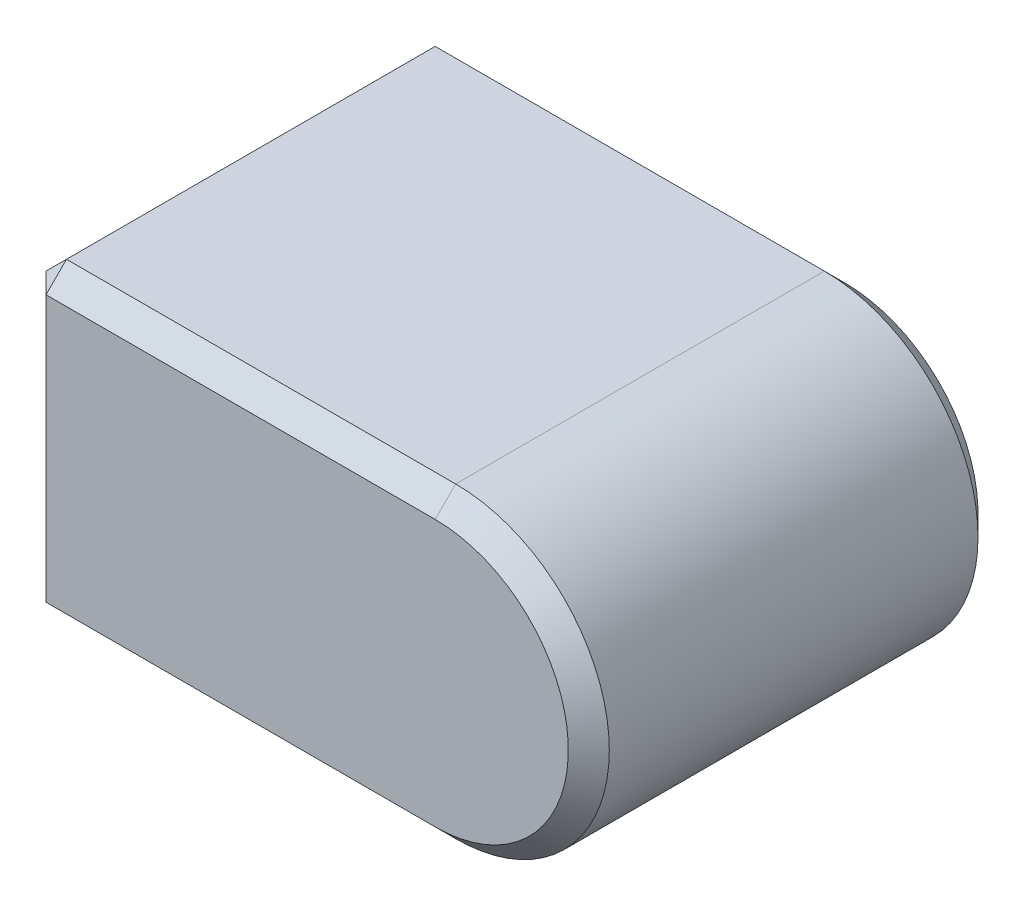
ISO-10303-21;
HEADER;
FILE_DESCRIPTION(('STEP AP214'),'2;1');
FILE_NAME('part.step','',(''),(''),'','','');
FILE_SCHEMA(('AUTOMOTIVE_DESIGN { 1 0 10303 214 1 1 1 1 }'));
ENDSEC;
DATA;
#1=APPLICATION_CONTEXT('core data for automotive mechanical design processes');
#2=APPLICATION_PROTOCOL_DEFINITION('international standard','automotive_design',2000,#1);
#3=PRODUCT_CONTEXT('',#1,'mechanical');
#4=PRODUCT('Part','Part','',(#3));
#5=PRODUCT_RELATED_PRODUCT_CATEGORY('part','',(#4));
#6=PRODUCT_DEFINITION_FORMATION('','',#4);
#7=PRODUCT_DEFINITION_CONTEXT('part definition',#1,'design');
#8=PRODUCT_DEFINITION('design','',#6,#7);
#9=PRODUCT_DEFINITION_SHAPE('','',#8);
#10=(LENGTH_UNIT() NAMED_UNIT(*) SI_UNIT(.MILLI.,.METRE.));
#11=(NAMED_UNIT(*) PLANE_ANGLE_UNIT() SI_UNIT($,.RADIAN.));
#12=(NAMED_UNIT(*) SI_UNIT($,.STERADIAN.) SOLID_ANGLE_UNIT());
#13=UNCERTAINTY_MEASURE_WITH_UNIT(LENGTH_MEASURE(1.E-05),#10,'distance_accuracy_value','');
#14=(GEOMETRIC_REPRESENTATION_CONTEXT(3) GLOBAL_UNCERTAINTY_ASSIGNED_CONTEXT((#13)) GLOBAL_UNIT_ASSIGNED_CONTEXT((#10,
#11,#12)) REPRESENTATION_CONTEXT('',''));
#15=CARTESIAN_POINT('',(0.,0.,0.));
#16=DIRECTION('',(0.,0.,1.));
#17=DIRECTION('',(1.,0.,0.));
#18=AXIS2_PLACEMENT_3D('',#15,#16,#17);
#19=CARTESIAN_POINT('',(2.,0.,4.));
#20=DIRECTION('',(0.,0.,-1.));
#21=DIRECTION('',(-1.,0.,0.));
#22=AXIS2_PLACEMENT_3D('',#19,#20,#21);
#23=CYLINDRICAL_SURFACE('',#22,1.5);
#24=DIRECTION('',(0.,0.,-1.));
#25=VECTOR('',#24,1.);
#26=CARTESIAN_POINT('',(2.,-1.5,4.));
#27=LINE('',#26,#25);
#28=CARTESIAN_POINT('',(2.,-1.5,3.8));
#29=VERTEX_POINT('',#28);
#30=CARTESIAN_POINT('',(2.,-1.5,0.2));
#31=VERTEX_POINT('',#30);
#32=EDGE_CURVE('E172',#29,#31,#27,.T.);
#33=ORIENTED_EDGE('',*,*,#32,.T.);
#34=CARTESIAN_POINT('',(2.,0.,0.2));
#35=DIRECTION('',(0.,0.,1.));
#36=DIRECTION('',(1.,0.,0.));
#37=AXIS2_PLACEMENT_3D('',#34,#35,#36);
#38=CIRCLE('',#37,1.5);
#39=CARTESIAN_POINT('',(2.,1.5,0.2));
#40=VERTEX_POINT('',#39);
#41=EDGE_CURVE('E211',#31,#40,#38,.T.);
#42=ORIENTED_EDGE('',*,*,#41,.T.);
#43=DIRECTION('',(0.,0.,-1.));
#44=VECTOR('',#43,1.);
#45=CARTESIAN_POINT('',(2.,1.5,4.));
#46=LINE('',#45,#44);
#47=CARTESIAN_POINT('',(2.,1.5,3.8));
#48=VERTEX_POINT('',#47);
#49=EDGE_CURVE('E137',#48,#40,#46,.T.);
#50=ORIENTED_EDGE('',*,*,#49,.F.);
#51=CARTESIAN_POINT('',(2.,0.,3.8));
#52=DIRECTION('',(0.,0.,1.));
#53=DIRECTION('',(1.,0.,0.));
#54=AXIS2_PLACEMENT_3D('',#51,#52,#53);
#55=CIRCLE('',#54,1.5);
#56=EDGE_CURVE('E209',#48,#29,#55,.F.);
#57=ORIENTED_EDGE('',*,*,#56,.T.);
#58=EDGE_LOOP('',(#33,#42,#50,#57));
#59=FACE_BOUND('',#58,.T.);
#60=ADVANCED_FACE('F39',(#59),#23,.T.);
#61=CARTESIAN_POINT('',(-2.,1.5,4.));
#62=DIRECTION('',(0.,-1.,0.));
#63=DIRECTION('',(1.,0.,0.));
#64=AXIS2_PLACEMENT_3D('',#61,#62,#63);
#65=PLANE('',#64);
#66=ORIENTED_EDGE('',*,*,#49,.T.);
#67=DIRECTION('',(-1.,0.,0.));
#68=VECTOR('',#67,1.);
#69=CARTESIAN_POINT('',(-2.,1.5,0.200000000000001));
#70=LINE('',#69,#68);
#71=CARTESIAN_POINT('',(-1.8,1.5,0.200000000000001));
#72=VERTEX_POINT('',#71);
#73=EDGE_CURVE('E191',#40,#72,#70,.T.);
#74=ORIENTED_EDGE('',*,*,#73,.T.);
#75=DIRECTION('',(0.,0.,1.));
#76=VECTOR('',#75,1.);
#77=CARTESIAN_POINT('',(-1.8,1.5,4.));
#78=LINE('',#77,#76);
#79=CARTESIAN_POINT('',(-1.8,1.5,3.8));
#80=VERTEX_POINT('',#79);
#81=EDGE_CURVE('E188',#72,#80,#78,.T.);
#82=ORIENTED_EDGE('',*,*,#81,.T.);
#83=DIRECTION('',(1.,0.,0.));
#84=VECTOR('',#83,1.);
#85=CARTESIAN_POINT('',(2.,1.5,3.8));
#86=LINE('',#85,#84);
#87=EDGE_CURVE('E186',#80,#48,#86,.T.);
#88=ORIENTED_EDGE('',*,*,#87,.T.);
#89=EDGE_LOOP('',(#66,#74,#82,#88));
#90=FACE_BOUND('',#89,.T.);
#91=ADVANCED_FACE('F240',(#90),#65,.F.);
#92=CARTESIAN_POINT('',(-2.,-1.5,4.));
#93=DIRECTION('',(1.,0.,0.));
#94=DIRECTION('',(0.,1.,0.));
#95=AXIS2_PLACEMENT_3D('',#92,#93,#94);
#96=PLANE('',#95);
#97=DIRECTION('',(0.,1.,0.));
#98=VECTOR('',#97,1.);
#99=CARTESIAN_POINT('',(-2.,1.5,3.8));
#100=LINE('',#99,#98);
#101=CARTESIAN_POINT('',(-2.,-1.3,3.8));
#102=VERTEX_POINT('',#101);
#103=CARTESIAN_POINT('',(-2.,1.3,3.8));
#104=VERTEX_POINT('',#103);
#105=EDGE_CURVE('E126',#102,#104,#100,.T.);
#106=ORIENTED_EDGE('',*,*,#105,.T.);
#107=DIRECTION('',(0.,0.,-1.));
#108=VECTOR('',#107,1.);
#109=CARTESIAN_POINT('',(-2.,1.3,4.));
#110=LINE('',#109,#108);
#111=CARTESIAN_POINT('',(-2.,1.3,0.2));
#112=VERTEX_POINT('',#111);
#113=EDGE_CURVE('E122',#104,#112,#110,.T.);
#114=ORIENTED_EDGE('',*,*,#113,.T.);
#115=DIRECTION('',(0.,-1.,0.));
#116=VECTOR('',#115,1.);
#117=CARTESIAN_POINT('',(-2.,-1.5,0.2));
#118=LINE('',#117,#116);
#119=CARTESIAN_POINT('',(-2.,-1.3,0.2));
#120=VERTEX_POINT('',#119);
#121=EDGE_CURVE('E116',#112,#120,#118,.T.);
#122=ORIENTED_EDGE('',*,*,#121,.T.);
#123=DIRECTION('',(0.,0.,1.));
#124=VECTOR('',#123,1.);
#125=CARTESIAN_POINT('',(-2.,-1.3,4.));
#126=LINE('',#125,#124);
#127=EDGE_CURVE('E119',#120,#102,#126,.T.);
#128=ORIENTED_EDGE('',*,*,#127,.T.);
#129=EDGE_LOOP('',(#106,#114,#122,#128));
#130=FACE_BOUND('',#129,.T.);
#131=ADVANCED_FACE('F118',(#130),#96,.F.);
#132=CARTESIAN_POINT('',(-2.,-1.5,4.));
#133=DIRECTION('',(0.,1.,0.));
#134=DIRECTION('',(-1.,0.,0.));
#135=AXIS2_PLACEMENT_3D('',#132,#133,#134);
#136=PLANE('',#135);
#137=DIRECTION('',(0.,0.,-1.));
#138=VECTOR('',#137,1.);
#139=CARTESIAN_POINT('',(-1.8,-1.5,4.));
#140=LINE('',#139,#138);
#141=CARTESIAN_POINT('',(-1.8,-1.5,3.8));
#142=VERTEX_POINT('',#141);
#143=CARTESIAN_POINT('',(-1.8,-1.5,0.2));
#144=VERTEX_POINT('',#143);
#145=EDGE_CURVE('E49',#142,#144,#140,.T.);
#146=ORIENTED_EDGE('',*,*,#145,.T.);
#147=DIRECTION('',(1.,0.,0.));
#148=VECTOR('',#147,1.);
#149=CARTESIAN_POINT('',(-2.,-1.5,0.2));
#150=LINE('',#149,#148);
#151=EDGE_CURVE('E11',#144,#31,#150,.T.);
#152=ORIENTED_EDGE('',*,*,#151,.T.);
#153=ORIENTED_EDGE('',*,*,#32,.F.);
#154=DIRECTION('',(-1.,0.,0.));
#155=VECTOR('',#154,1.);
#156=CARTESIAN_POINT('',(-2.,-1.5,3.8));
#157=LINE('',#156,#155);
#158=EDGE_CURVE('E60',#29,#142,#157,.T.);
#159=ORIENTED_EDGE('',*,*,#158,.T.);
#160=EDGE_LOOP('',(#146,#152,#153,#159));
#161=FACE_BOUND('',#160,.T.);
#162=ADVANCED_FACE('F259',(#161),#136,.F.);
#163=CARTESIAN_POINT('',(2.,0.,4.));
#164=DIRECTION('',(0.,0.,1.));
#165=DIRECTION('',(1.,0.,0.));
#166=AXIS2_PLACEMENT_3D('',#163,#164,#165);
#167=PLANE('',#166);
#168=DIRECTION('',(-1.,0.,0.));
#169=VECTOR('',#168,1.);
#170=CARTESIAN_POINT('',(-2.,1.3,4.));
#171=LINE('',#170,#169);
#172=CARTESIAN_POINT('',(2.,1.3,4.));
#173=VERTEX_POINT('',#172);
#174=CARTESIAN_POINT('',(-1.8,1.3,4.));
#175=VERTEX_POINT('',#174);
#176=EDGE_CURVE('E193',#173,#175,#171,.T.);
#177=ORIENTED_EDGE('',*,*,#176,.T.);
#178=DIRECTION('',(0.,-1.,0.));
#179=VECTOR('',#178,1.);
#180=CARTESIAN_POINT('',(-1.8,-1.5,4.));
#181=LINE('',#180,#179);
#182=CARTESIAN_POINT('',(-1.8,-1.3,4.));
#183=VERTEX_POINT('',#182);
#184=EDGE_CURVE('E199',#175,#183,#181,.T.);
#185=ORIENTED_EDGE('',*,*,#184,.T.);
#186=DIRECTION('',(1.,0.,0.));
#187=VECTOR('',#186,1.);
#188=CARTESIAN_POINT('',(2.,-1.3,4.));
#189=LINE('',#188,#187);
#190=CARTESIAN_POINT('',(2.,-1.3,4.));
#191=VERTEX_POINT('',#190);
#192=EDGE_CURVE('E197',#183,#191,#189,.T.);
#193=ORIENTED_EDGE('',*,*,#192,.T.);
#194=CARTESIAN_POINT('',(2.,0.,4.));
#195=DIRECTION('',(0.,0.,1.));
#196=DIRECTION('',(1.,0.,0.));
#197=AXIS2_PLACEMENT_3D('',#194,#195,#196);
#198=CIRCLE('',#197,1.3);
#199=EDGE_CURVE('E195',#191,#173,#198,.T.);
#200=ORIENTED_EDGE('',*,*,#199,.T.);
#201=EDGE_LOOP('',(#177,#185,#193,#200));
#202=FACE_BOUND('',#201,.T.);
#203=ADVANCED_FACE('F267',(#202),#167,.T.);
#204=CARTESIAN_POINT('',(2.,0.,0.));
#205=DIRECTION('',(0.,0.,1.));
#206=DIRECTION('',(1.,0.,0.));
#207=AXIS2_PLACEMENT_3D('',#204,#205,#206);
#208=PLANE('',#207);
#209=DIRECTION('',(-1.,0.,0.));
#210=VECTOR('',#209,1.);
#211=CARTESIAN_POINT('',(2.,-1.3,0.));
#212=LINE('',#211,#210);
#213=CARTESIAN_POINT('',(2.,-1.3,0.));
#214=VERTEX_POINT('',#213);
#215=CARTESIAN_POINT('',(-1.8,-1.3,0.));
#216=VERTEX_POINT('',#215);
#217=EDGE_CURVE('E202',#214,#216,#212,.T.);
#218=ORIENTED_EDGE('',*,*,#217,.T.);
#219=DIRECTION('',(0.,1.,0.));
#220=VECTOR('',#219,1.);
#221=CARTESIAN_POINT('',(-1.8,0.,0.));
#222=LINE('',#221,#220);
#223=CARTESIAN_POINT('',(-1.8,1.3,0.));
#224=VERTEX_POINT('',#223);
#225=EDGE_CURVE('E149',#216,#224,#222,.T.);
#226=ORIENTED_EDGE('',*,*,#225,.T.);
#227=DIRECTION('',(1.,0.,0.));
#228=VECTOR('',#227,1.);
#229=CARTESIAN_POINT('',(2.,1.3,0.));
#230=LINE('',#229,#228);
#231=CARTESIAN_POINT('',(2.,1.3,0.));
#232=VERTEX_POINT('',#231);
#233=EDGE_CURVE('E206',#224,#232,#230,.T.);
#234=ORIENTED_EDGE('',*,*,#233,.T.);
#235=CARTESIAN_POINT('',(2.,0.,0.));
#236=DIRECTION('',(0.,0.,1.));
#237=DIRECTION('',(1.,0.,0.));
#238=AXIS2_PLACEMENT_3D('',#235,#236,#237);
#239=CIRCLE('',#238,1.3);
#240=EDGE_CURVE('E204',#232,#214,#239,.F.);
#241=ORIENTED_EDGE('',*,*,#240,.T.);
#242=EDGE_LOOP('',(#218,#226,#234,#241));
#243=FACE_BOUND('',#242,.T.);
#244=ADVANCED_FACE('F254',(#243),#208,.F.);
#245=CARTESIAN_POINT('',(2.,-1.3,4.));
#246=DIRECTION('',(0.,-0.70710678118655,0.707106781186545));
#247=DIRECTION('',(-1.,0.,0.));
#248=AXIS2_PLACEMENT_3D('',#245,#246,#247);
#249=PLANE('',#248);
#250=DIRECTION('',(0.,0.707106781186545,0.70710678118655));
#251=VECTOR('',#250,1.);
#252=CARTESIAN_POINT('',(-1.8,-1.3,4.));
#253=LINE('',#252,#251);
#254=EDGE_CURVE('E166',#142,#183,#253,.T.);
#255=ORIENTED_EDGE('',*,*,#254,.F.);
#256=ORIENTED_EDGE('',*,*,#158,.F.);
#257=DIRECTION('',(0.,-0.707106781186545,-0.70710678118655));
#258=VECTOR('',#257,1.);
#259=CARTESIAN_POINT('',(2.,-1.3,4.));
#260=LINE('',#259,#258);
#261=EDGE_CURVE('E44',#191,#29,#260,.T.);
#262=ORIENTED_EDGE('',*,*,#261,.F.);
#263=ORIENTED_EDGE('',*,*,#192,.F.);
#264=EDGE_LOOP('',(#255,#256,#262,#263));
#265=FACE_BOUND('',#264,.T.);
#266=ADVANCED_FACE('F42',(#265),#249,.T.);
#267=CARTESIAN_POINT('',(-1.8,-1.5,4.));
#268=DIRECTION('',(0.70710678118655,0.707106781186545,0.));
#269=DIRECTION('',(0.,0.,-1.));
#270=AXIS2_PLACEMENT_3D('',#267,#268,#269);
#271=PLANE('',#270);
#272=DIRECTION('',(0.707106781186545,-0.70710678118655,0.));
#273=VECTOR('',#272,1.);
#274=CARTESIAN_POINT('',(-2.,-1.3,0.2));
#275=LINE('',#274,#273);
#276=EDGE_CURVE('E132',#144,#120,#275,.F.);
#277=ORIENTED_EDGE('',*,*,#276,.F.);
#278=ORIENTED_EDGE('',*,*,#145,.F.);
#279=DIRECTION('',(-0.707106781186545,0.70710678118655,0.));
#280=VECTOR('',#279,1.);
#281=CARTESIAN_POINT('',(-1.9,-1.4,3.8));
#282=LINE('',#281,#280);
#283=EDGE_CURVE('E135',#102,#142,#282,.F.);
#284=ORIENTED_EDGE('',*,*,#283,.F.);
#285=ORIENTED_EDGE('',*,*,#127,.F.);
#286=EDGE_LOOP('',(#277,#278,#284,#285));
#287=FACE_BOUND('',#286,.T.);
#288=ADVANCED_FACE('F131',(#287),#271,.F.);
#289=CARTESIAN_POINT('',(-2.,-1.5,0.2));
#290=DIRECTION('',(0.,0.707106781186545,0.70710678118655));
#291=DIRECTION('',(1.,0.,0.));
#292=AXIS2_PLACEMENT_3D('',#289,#290,#291);
#293=PLANE('',#292);
#294=DIRECTION('',(0.,0.70710678118655,-0.707106781186545));
#295=VECTOR('',#294,1.);
#296=CARTESIAN_POINT('',(2.,-1.5,0.2));
#297=LINE('',#296,#295);
#298=EDGE_CURVE('E162',#31,#214,#297,.T.);
#299=ORIENTED_EDGE('',*,*,#298,.F.);
#300=ORIENTED_EDGE('',*,*,#151,.F.);
#301=DIRECTION('',(0.,0.70710678118655,-0.707106781186545));
#302=VECTOR('',#301,1.);
#303=CARTESIAN_POINT('',(-1.8,-1.4,0.0999999999999997));
#304=LINE('',#303,#302);
#305=EDGE_CURVE('E145',#216,#144,#304,.F.);
#306=ORIENTED_EDGE('',*,*,#305,.F.);
#307=ORIENTED_EDGE('',*,*,#217,.F.);
#308=EDGE_LOOP('',(#299,#300,#306,#307));
#309=FACE_BOUND('',#308,.T.);
#310=ADVANCED_FACE('F257',(#309),#293,.F.);
#311=CARTESIAN_POINT('',(2.,0.,4.));
#312=DIRECTION('',(0.,0.,-1.));
#313=DIRECTION('',(-1.,0.,0.));
#314=AXIS2_PLACEMENT_3D('',#311,#312,#313);
#315=CONICAL_SURFACE('',#314,1.3,0.785398163397445);
#316=ORIENTED_EDGE('',*,*,#261,.T.);
#317=ORIENTED_EDGE('',*,*,#56,.F.);
#318=DIRECTION('',(0.,0.707106781186545,-0.70710678118655));
#319=VECTOR('',#318,1.);
#320=CARTESIAN_POINT('',(2.,1.3,4.));
#321=LINE('',#320,#319);
#322=EDGE_CURVE('E153',#173,#48,#321,.T.);
#323=ORIENTED_EDGE('',*,*,#322,.F.);
#324=ORIENTED_EDGE('',*,*,#199,.F.);
#325=EDGE_LOOP('',(#316,#317,#323,#324));
#326=FACE_BOUND('',#325,.T.);
#327=ADVANCED_FACE('F268',(#326),#315,.T.);
#328=CARTESIAN_POINT('',(-1.8,-1.3,4.));
#329=DIRECTION('',(-0.57735026918963,-0.577350269189626,0.577350269189622));
#330=DIRECTION('',(0.707106781186545,-0.70710678118655,0.));
#331=AXIS2_PLACEMENT_3D('',#328,#329,#330);
#332=PLANE('',#331);
#333=ORIENTED_EDGE('',*,*,#283,.T.);
#334=ORIENTED_EDGE('',*,*,#254,.T.);
#335=DIRECTION('',(-0.707106781186545,0.,-0.70710678118655));
#336=VECTOR('',#335,1.);
#337=CARTESIAN_POINT('',(-1.8,-1.3,4.));
#338=LINE('',#337,#336);
#339=EDGE_CURVE('E150',#102,#183,#338,.F.);
#340=ORIENTED_EDGE('',*,*,#339,.F.);
#341=EDGE_LOOP('',(#333,#334,#340));
#342=FACE_BOUND('',#341,.T.);
#343=ADVANCED_FACE('F261',(#342),#332,.T.);
#344=CARTESIAN_POINT('',(-2.,-1.3,0.2));
#345=DIRECTION('',(-0.577350269189626,-0.577350269189622,-0.577350269189629));
#346=DIRECTION('',(-0.70710678118655,0.,0.707106781186546));
#347=AXIS2_PLACEMENT_3D('',#344,#345,#346);
#348=PLANE('',#347);
#349=ORIENTED_EDGE('',*,*,#305,.T.);
#350=ORIENTED_EDGE('',*,*,#276,.T.);
#351=DIRECTION('',(-0.707106781186549,0.,0.707106781186546));
#352=VECTOR('',#351,1.);
#353=CARTESIAN_POINT('',(-2.,-1.3,0.2));
#354=LINE('',#353,#352);
#355=EDGE_CURVE('E142',#216,#120,#354,.T.);
#356=ORIENTED_EDGE('',*,*,#355,.F.);
#357=EDGE_LOOP('',(#349,#350,#356));
#358=FACE_BOUND('',#357,.T.);
#359=ADVANCED_FACE('F141',(#358),#348,.T.);
#360=CARTESIAN_POINT('',(2.,0.,0.2));
#361=DIRECTION('',(0.,0.,1.));
#362=DIRECTION('',(1.,0.,0.));
#363=AXIS2_PLACEMENT_3D('',#360,#361,#362);
#364=CONICAL_SURFACE('',#363,1.5,0.785398163397451);
#365=ORIENTED_EDGE('',*,*,#298,.T.);
#366=ORIENTED_EDGE('',*,*,#240,.F.);
#367=DIRECTION('',(0.,-0.70710678118655,-0.707106781186545));
#368=VECTOR('',#367,1.);
#369=CARTESIAN_POINT('',(2.,1.5,0.2));
#370=LINE('',#369,#368);
#371=EDGE_CURVE('E151',#40,#232,#370,.T.);
#372=ORIENTED_EDGE('',*,*,#371,.F.);
#373=ORIENTED_EDGE('',*,*,#41,.F.);
#374=EDGE_LOOP('',(#365,#366,#372,#373));
#375=FACE_BOUND('',#374,.T.);
#376=ADVANCED_FACE('F270',(#375),#364,.T.);
#377=CARTESIAN_POINT('',(2.,1.3,4.));
#378=DIRECTION('',(0.,0.70710678118655,0.707106781186545));
#379=DIRECTION('',(1.,0.,0.));
#380=AXIS2_PLACEMENT_3D('',#377,#378,#379);
#381=PLANE('',#380);
#382=ORIENTED_EDGE('',*,*,#322,.T.);
#383=ORIENTED_EDGE('',*,*,#87,.F.);
#384=DIRECTION('',(0.,0.707106781186545,-0.70710678118655));
#385=VECTOR('',#384,1.);
#386=CARTESIAN_POINT('',(-1.8,1.5,3.8));
#387=LINE('',#386,#385);
#388=EDGE_CURVE('E156',#175,#80,#387,.T.);
#389=ORIENTED_EDGE('',*,*,#388,.F.);
#390=ORIENTED_EDGE('',*,*,#176,.F.);
#391=EDGE_LOOP('',(#382,#383,#389,#390));
#392=FACE_BOUND('',#391,.T.);
#393=ADVANCED_FACE('F235',(#392),#381,.T.);
#394=CARTESIAN_POINT('',(-1.8,0.,4.));
#395=DIRECTION('',(-0.70710678118655,0.,0.707106781186545));
#396=DIRECTION('',(0.,1.,0.));
#397=AXIS2_PLACEMENT_3D('',#394,#395,#396);
#398=PLANE('',#397);
#399=ORIENTED_EDGE('',*,*,#339,.T.);
#400=ORIENTED_EDGE('',*,*,#184,.F.);
#401=DIRECTION('',(0.707106781186545,0.,0.70710678118655));
#402=VECTOR('',#401,1.);
#403=CARTESIAN_POINT('',(-1.9,1.3,3.9));
#404=LINE('',#403,#402);
#405=EDGE_CURVE('E224',#104,#175,#404,.T.);
#406=ORIENTED_EDGE('',*,*,#405,.F.);
#407=ORIENTED_EDGE('',*,*,#105,.F.);
#408=EDGE_LOOP('',(#399,#400,#406,#407));
#409=FACE_BOUND('',#408,.T.);
#410=ADVANCED_FACE('F265',(#409),#398,.T.);
#411=CARTESIAN_POINT('',(-2.,-1.5,0.2));
#412=DIRECTION('',(0.707106781186546,0.,0.707106781186549));
#413=DIRECTION('',(0.,-1.,0.));
#414=AXIS2_PLACEMENT_3D('',#411,#412,#413);
#415=PLANE('',#414);
#416=ORIENTED_EDGE('',*,*,#355,.T.);
#417=ORIENTED_EDGE('',*,*,#121,.F.);
#418=DIRECTION('',(0.707106781186549,0.,-0.707106781186546));
#419=VECTOR('',#418,1.);
#420=CARTESIAN_POINT('',(-2.,1.3,0.2));
#421=LINE('',#420,#419);
#422=EDGE_CURVE('E221',#224,#112,#421,.F.);
#423=ORIENTED_EDGE('',*,*,#422,.F.);
#424=ORIENTED_EDGE('',*,*,#225,.F.);
#425=EDGE_LOOP('',(#416,#417,#423,#424));
#426=FACE_BOUND('',#425,.T.);
#427=ADVANCED_FACE('F147',(#426),#415,.F.);
#428=CARTESIAN_POINT('',(-2.,1.5,0.200000000000001));
#429=DIRECTION('',(0.,-0.70710678118655,0.707106781186545));
#430=DIRECTION('',(-1.,0.,0.));
#431=AXIS2_PLACEMENT_3D('',#428,#429,#430);
#432=PLANE('',#431);
#433=ORIENTED_EDGE('',*,*,#371,.T.);
#434=ORIENTED_EDGE('',*,*,#233,.F.);
#435=DIRECTION('',(0.,0.707106781186545,0.70710678118655));
#436=VECTOR('',#435,1.);
#437=CARTESIAN_POINT('',(-1.8,1.4,0.1));
#438=LINE('',#437,#436);
#439=EDGE_CURVE('E219',#72,#224,#438,.F.);
#440=ORIENTED_EDGE('',*,*,#439,.F.);
#441=ORIENTED_EDGE('',*,*,#73,.F.);
#442=EDGE_LOOP('',(#433,#434,#440,#441));
#443=FACE_BOUND('',#442,.T.);
#444=ADVANCED_FACE('F250',(#443),#432,.F.);
#445=CARTESIAN_POINT('',(-1.8,1.5,3.8));
#446=DIRECTION('',(-0.577350269189626,0.57735026918963,0.577350269189622));
#447=DIRECTION('',(-0.70710678118655,-0.707106781186545,0.));
#448=AXIS2_PLACEMENT_3D('',#445,#446,#447);
#449=PLANE('',#448);
#450=ORIENTED_EDGE('',*,*,#405,.T.);
#451=ORIENTED_EDGE('',*,*,#388,.T.);
#452=DIRECTION('',(0.70710678118655,0.707106781186545,0.));
#453=VECTOR('',#452,1.);
#454=CARTESIAN_POINT('',(-1.8,1.5,3.8));
#455=LINE('',#454,#453);
#456=EDGE_CURVE('E217',#104,#80,#455,.T.);
#457=ORIENTED_EDGE('',*,*,#456,.F.);
#458=EDGE_LOOP('',(#450,#451,#457));
#459=FACE_BOUND('',#458,.T.);
#460=ADVANCED_FACE('F231',(#459),#449,.T.);
#461=CARTESIAN_POINT('',(-2.,1.3,0.2));
#462=DIRECTION('',(-0.577350269189622,0.57735026918963,-0.577350269189625));
#463=DIRECTION('',(0.,0.707106781186545,0.70710678118655));
#464=AXIS2_PLACEMENT_3D('',#461,#462,#463);
#465=PLANE('',#464);
#466=ORIENTED_EDGE('',*,*,#439,.T.);
#467=ORIENTED_EDGE('',*,*,#422,.T.);
#468=DIRECTION('',(-0.70710678118655,-0.707106781186545,0.));
#469=VECTOR('',#468,1.);
#470=CARTESIAN_POINT('',(-2.,1.3,0.2));
#471=LINE('',#470,#469);
#472=EDGE_CURVE('E215',#72,#112,#471,.T.);
#473=ORIENTED_EDGE('',*,*,#472,.F.);
#474=EDGE_LOOP('',(#466,#467,#473));
#475=FACE_BOUND('',#474,.T.);
#476=ADVANCED_FACE('F247',(#475),#465,.T.);
#477=CARTESIAN_POINT('',(-2.,1.3,4.));
#478=DIRECTION('',(0.707106781186545,-0.70710678118655,0.));
#479=DIRECTION('',(0.,0.,-1.));
#480=AXIS2_PLACEMENT_3D('',#477,#478,#479);
#481=PLANE('',#480);
#482=ORIENTED_EDGE('',*,*,#456,.T.);
#483=ORIENTED_EDGE('',*,*,#81,.F.);
#484=ORIENTED_EDGE('',*,*,#472,.T.);
#485=ORIENTED_EDGE('',*,*,#113,.F.);
#486=EDGE_LOOP('',(#482,#483,#484,#485));
#487=FACE_BOUND('',#486,.T.);
#488=ADVANCED_FACE('F245',(#487),#481,.F.);
#489=CLOSED_SHELL('',(#60,#91,#131,#162,#203,#244,#266,#288,#310,#327,#343,#359,#376,#393,#410,
#427,#444,#460,#476,#488));
#490=MANIFOLD_SOLID_BREP('B2',#489);
#491=ADVANCED_BREP_SHAPE_REPRESENTATION('',(#18,#490),#14);
#492=SHAPE_DEFINITION_REPRESENTATION(#9,#491);
ENDSEC;
END-ISO-10303-21;
